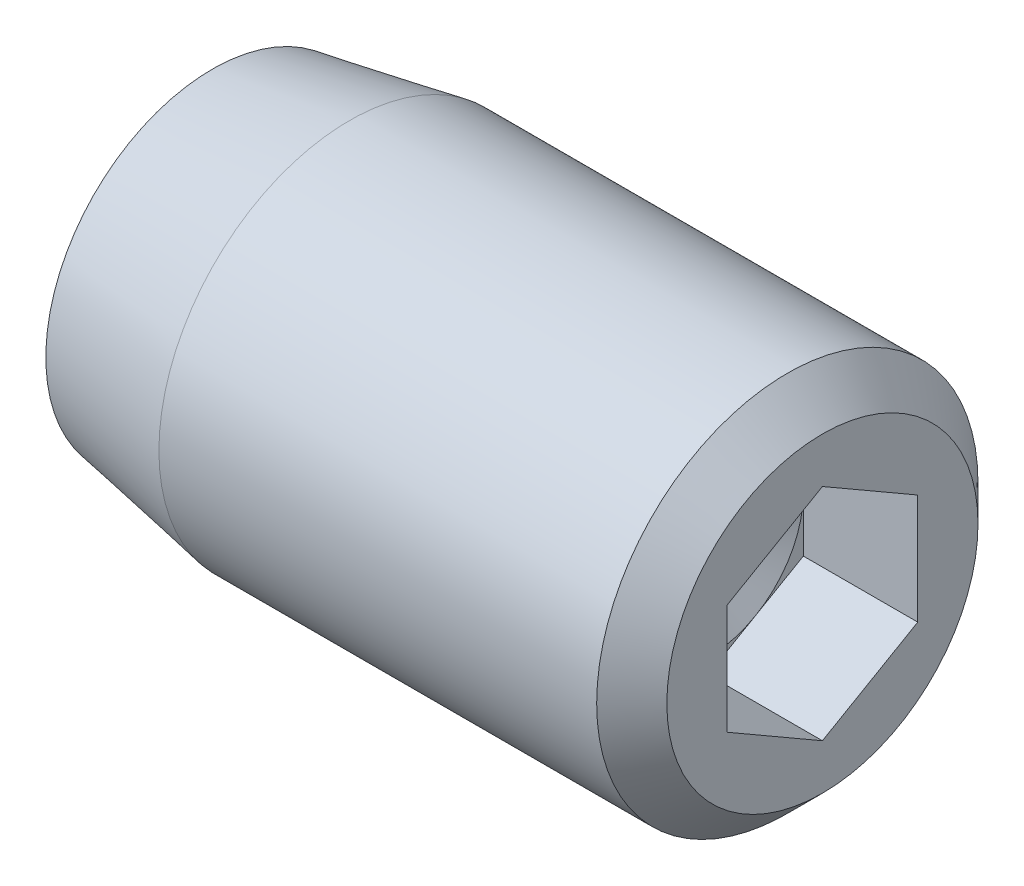
ISO-10303-21;
HEADER;
FILE_DESCRIPTION(('STEP AP214'),'2;1');
FILE_NAME('part.step','',(''),(''),'','','');
FILE_SCHEMA(('AUTOMOTIVE_DESIGN { 1 0 10303 214 1 1 1 1 }'));
ENDSEC;
DATA;
#1=APPLICATION_CONTEXT('core data for automotive mechanical design processes');
#2=APPLICATION_PROTOCOL_DEFINITION('international standard','automotive_design',2000,#1);
#3=PRODUCT_CONTEXT('',#1,'mechanical');
#4=PRODUCT('Part','Part','',(#3));
#5=PRODUCT_RELATED_PRODUCT_CATEGORY('part','',(#4));
#6=PRODUCT_DEFINITION_FORMATION('','',#4);
#7=PRODUCT_DEFINITION_CONTEXT('part definition',#1,'design');
#8=PRODUCT_DEFINITION('design','',#6,#7);
#9=PRODUCT_DEFINITION_SHAPE('','',#8);
#10=(LENGTH_UNIT() NAMED_UNIT(*) SI_UNIT(.MILLI.,.METRE.));
#11=(NAMED_UNIT(*) PLANE_ANGLE_UNIT() SI_UNIT($,.RADIAN.));
#12=(NAMED_UNIT(*) SI_UNIT($,.STERADIAN.) SOLID_ANGLE_UNIT());
#13=UNCERTAINTY_MEASURE_WITH_UNIT(LENGTH_MEASURE(1.E-05),#10,'distance_accuracy_value','');
#14=(GEOMETRIC_REPRESENTATION_CONTEXT(3) GLOBAL_UNCERTAINTY_ASSIGNED_CONTEXT((#13)) GLOBAL_UNIT_ASSIGNED_CONTEXT((#10,
#11,#12)) REPRESENTATION_CONTEXT('',''));
#15=CARTESIAN_POINT('',(0.,0.,0.));
#16=DIRECTION('',(0.,0.,1.));
#17=DIRECTION('',(1.,0.,0.));
#18=AXIS2_PLACEMENT_3D('',#15,#16,#17);
#19=CARTESIAN_POINT('',(13.,-2.8867513459481,1.24999999999996));
#20=DIRECTION('',(1.,0.,0.));
#21=DIRECTION('',(0.,0.,-1.));
#22=AXIS2_PLACEMENT_3D('',#19,#20,#21);
#23=PLANE('',#22);
#24=DIRECTION('',(0.,0.499999999999984,-0.866025403784448));
#25=VECTOR('',#24,1.);
#26=CARTESIAN_POINT('',(13.,-2.8867513459481,0.));
#27=LINE('',#26,#25);
#28=CARTESIAN_POINT('',(13.,-2.8867513459481,0.));
#29=VERTEX_POINT('',#28);
#30=CARTESIAN_POINT('',(13.,-2.16506350946112,-1.24999999999996));
#31=VERTEX_POINT('',#30);
#32=EDGE_CURVE('P0_E94',#29,#31,#27,.T.);
#33=ORIENTED_EDGE('',*,*,#32,.T.);
#34=CARTESIAN_POINT('',(13.,0.,0.));
#35=DIRECTION('',(-1.,0.,0.));
#36=DIRECTION('',(0.,-0.866025403784448,-0.499999999999983));
#37=AXIS2_PLACEMENT_3D('',#34,#35,#36);
#38=CIRCLE('',#37,2.49999999999999);
#39=CARTESIAN_POINT('',(13.,-2.16506350946111,1.24999999999996));
#40=VERTEX_POINT('',#39);
#41=EDGE_CURVE('P0_E108',#31,#40,#38,.T.);
#42=ORIENTED_EDGE('',*,*,#41,.T.);
#43=DIRECTION('',(0.,-0.499999999999985,-0.866025403784447));
#44=VECTOR('',#43,1.);
#45=CARTESIAN_POINT('',(13.,-2.16506350946112,1.24999999999996));
#46=LINE('',#45,#44);
#47=EDGE_CURVE('P0_E110',#40,#29,#46,.T.);
#48=ORIENTED_EDGE('',*,*,#47,.T.);
#49=EDGE_LOOP('',(#33,#42,#48));
#50=FACE_BOUND('',#49,.T.);
#51=ADVANCED_FACE('P0_F16',(#50),#23,.T.);
#52=CARTESIAN_POINT('',(13.,-2.16506350946112,2.5));
#53=DIRECTION('',(1.,0.,0.));
#54=DIRECTION('',(0.,0.,-1.));
#55=AXIS2_PLACEMENT_3D('',#52,#53,#54);
#56=PLANE('',#55);
#57=DIRECTION('',(0.,-0.499999999999982,-0.866025403784449));
#58=VECTOR('',#57,1.);
#59=CARTESIAN_POINT('',(13.,-1.4433756729741,2.5));
#60=LINE('',#59,#58);
#61=CARTESIAN_POINT('',(13.,-1.4433756729741,2.5));
#62=VERTEX_POINT('',#61);
#63=EDGE_CURVE('P0_E335',#62,#40,#60,.T.);
#64=ORIENTED_EDGE('',*,*,#63,.T.);
#65=CARTESIAN_POINT('',(13.,0.,0.));
#66=DIRECTION('',(-1.,0.,0.));
#67=DIRECTION('',(0.,-0.866025403784448,0.499999999999984));
#68=AXIS2_PLACEMENT_3D('',#65,#66,#67);
#69=CIRCLE('',#68,2.49999999999999);
#70=CARTESIAN_POINT('',(13.,0.,2.49999999999999));
#71=VERTEX_POINT('',#70);
#72=EDGE_CURVE('P0_E115',#40,#71,#69,.T.);
#73=ORIENTED_EDGE('',*,*,#72,.T.);
#74=DIRECTION('',(0.,-1.,0.));
#75=VECTOR('',#74,1.);
#76=CARTESIAN_POINT('',(13.,0.,2.5));
#77=LINE('',#76,#75);
#78=EDGE_CURVE('P0_E325',#71,#62,#77,.T.);
#79=ORIENTED_EDGE('',*,*,#78,.T.);
#80=EDGE_LOOP('',(#64,#73,#79));
#81=FACE_BOUND('',#80,.T.);
#82=ADVANCED_FACE('P0_F263',(#81),#56,.T.);
#83=CARTESIAN_POINT('',(13.,0.,2.5));
#84=DIRECTION('',(1.,0.,0.));
#85=DIRECTION('',(0.,0.,-1.));
#86=AXIS2_PLACEMENT_3D('',#83,#84,#85);
#87=PLANE('',#86);
#88=DIRECTION('',(0.,-1.,0.));
#89=VECTOR('',#88,1.);
#90=CARTESIAN_POINT('',(13.,1.4433756729741,2.5));
#91=LINE('',#90,#89);
#92=CARTESIAN_POINT('',(13.,1.4433756729741,2.5));
#93=VERTEX_POINT('',#92);
#94=EDGE_CURVE('P0_E319',#93,#71,#91,.T.);
#95=ORIENTED_EDGE('',*,*,#94,.T.);
#96=CARTESIAN_POINT('',(13.,0.,0.));
#97=DIRECTION('',(-1.,0.,0.));
#98=DIRECTION('',(0.,0.,1.));
#99=AXIS2_PLACEMENT_3D('',#96,#97,#98);
#100=CIRCLE('',#99,2.49999999999999);
#101=CARTESIAN_POINT('',(13.,2.16506350946112,1.24999999999996));
#102=VERTEX_POINT('',#101);
#103=EDGE_CURVE('P0_E296',#71,#102,#100,.T.);
#104=ORIENTED_EDGE('',*,*,#103,.T.);
#105=DIRECTION('',(0.,-0.499999999999982,0.866025403784449));
#106=VECTOR('',#105,1.);
#107=CARTESIAN_POINT('',(13.,2.16506350946112,1.24999999999996));
#108=LINE('',#107,#106);
#109=EDGE_CURVE('P0_E289',#102,#93,#108,.T.);
#110=ORIENTED_EDGE('',*,*,#109,.T.);
#111=EDGE_LOOP('',(#95,#104,#110));
#112=FACE_BOUND('',#111,.T.);
#113=ADVANCED_FACE('P0_F268',(#112),#87,.T.);
#114=CARTESIAN_POINT('',(13.,2.16506350946112,1.24999999999996));
#115=DIRECTION('',(1.,0.,0.));
#116=DIRECTION('',(0.,0.,-1.));
#117=AXIS2_PLACEMENT_3D('',#114,#115,#116);
#118=PLANE('',#117);
#119=DIRECTION('',(0.,-0.499999999999983,0.866025403784448));
#120=VECTOR('',#119,1.);
#121=CARTESIAN_POINT('',(13.,2.8867513459481,0.));
#122=LINE('',#121,#120);
#123=CARTESIAN_POINT('',(13.,2.8867513459481,0.));
#124=VERTEX_POINT('',#123);
#125=EDGE_CURVE('P0_E282',#124,#102,#122,.T.);
#126=ORIENTED_EDGE('',*,*,#125,.T.);
#127=CARTESIAN_POINT('',(13.,0.,0.));
#128=DIRECTION('',(-1.,0.,0.));
#129=DIRECTION('',(0.,0.866025403784448,0.499999999999983));
#130=AXIS2_PLACEMENT_3D('',#127,#128,#129);
#131=CIRCLE('',#130,2.49999999999999);
#132=CARTESIAN_POINT('',(13.,2.16506350946112,-1.24999999999995));
#133=VERTEX_POINT('',#132);
#134=EDGE_CURVE('P0_E283',#102,#133,#131,.T.);
#135=ORIENTED_EDGE('',*,*,#134,.T.);
#136=DIRECTION('',(0.,0.499999999999984,0.866025403784448));
#137=VECTOR('',#136,1.);
#138=CARTESIAN_POINT('',(13.,2.16506350946112,-1.24999999999996));
#139=LINE('',#138,#137);
#140=EDGE_CURVE('P0_E125',#133,#124,#139,.T.);
#141=ORIENTED_EDGE('',*,*,#140,.T.);
#142=EDGE_LOOP('',(#126,#135,#141));
#143=FACE_BOUND('',#142,.T.);
#144=ADVANCED_FACE('P0_F260',(#143),#118,.T.);
#145=CARTESIAN_POINT('',(13.,-2.16506350946112,-1.24999999999996));
#146=DIRECTION('',(1.,0.,0.));
#147=DIRECTION('',(0.,0.,-1.));
#148=AXIS2_PLACEMENT_3D('',#145,#146,#147);
#149=PLANE('',#148);
#150=DIRECTION('',(0.,1.,0.));
#151=VECTOR('',#150,1.);
#152=CARTESIAN_POINT('',(13.,-1.4433756729741,-2.5));
#153=LINE('',#152,#151);
#154=CARTESIAN_POINT('',(13.,-1.4433756729741,-2.5));
#155=VERTEX_POINT('',#154);
#156=CARTESIAN_POINT('',(13.,0.,-2.5));
#157=VERTEX_POINT('',#156);
#158=EDGE_CURVE('P0_E119',#155,#157,#153,.T.);
#159=ORIENTED_EDGE('',*,*,#158,.T.);
#160=CARTESIAN_POINT('',(13.,0.,0.));
#161=DIRECTION('',(-1.,0.,0.));
#162=DIRECTION('',(0.,0.,-1.));
#163=AXIS2_PLACEMENT_3D('',#160,#161,#162);
#164=CIRCLE('',#163,2.49999999999999);
#165=EDGE_CURVE('P0_E102',#157,#31,#164,.T.);
#166=ORIENTED_EDGE('',*,*,#165,.T.);
#167=DIRECTION('',(0.,0.499999999999982,-0.866025403784449));
#168=VECTOR('',#167,1.);
#169=CARTESIAN_POINT('',(13.,-2.16506350946112,-1.24999999999996));
#170=LINE('',#169,#168);
#171=EDGE_CURVE('P0_E90',#31,#155,#170,.T.);
#172=ORIENTED_EDGE('',*,*,#171,.T.);
#173=EDGE_LOOP('',(#159,#166,#172));
#174=FACE_BOUND('',#173,.T.);
#175=ADVANCED_FACE('P0_F118',(#174),#149,.T.);
#176=CARTESIAN_POINT('',(10.,-3.,3.));
#177=DIRECTION('',(-1.,0.,0.));
#178=DIRECTION('',(0.,1.,0.));
#179=AXIS2_PLACEMENT_3D('',#176,#177,#178);
#180=PLANE('',#179);
#181=CARTESIAN_POINT('',(10.,0.,0.));
#182=DIRECTION('',(-1.,0.,0.));
#183=DIRECTION('',(0.,0.,-1.));
#184=AXIS2_PLACEMENT_3D('',#181,#182,#183);
#185=CIRCLE('',#184,3.);
#186=CARTESIAN_POINT('',(10.,0.,-3.));
#187=VERTEX_POINT('',#186);
#188=EDGE_CURVE('P0_E101',#187,#187,#185,.F.);
#189=ORIENTED_EDGE('',*,*,#188,.F.);
#190=EDGE_LOOP('',(#189));
#191=FACE_BOUND('',#190,.T.);
#192=ADVANCED_FACE('P0_F244',(#191),#180,.T.);
#193=CARTESIAN_POINT('',(0.,-4.36522286944953,4.36522320467784));
#194=DIRECTION('',(-1.,0.,0.));
#195=DIRECTION('',(0.,1.,0.));
#196=AXIS2_PLACEMENT_3D('',#193,#194,#195);
#197=PLANE('',#196);
#198=CARTESIAN_POINT('',(0.,0.,0.));
#199=DIRECTION('',(-1.,0.,0.));
#200=DIRECTION('',(0.,0.,-1.));
#201=AXIS2_PLACEMENT_3D('',#198,#199,#200);
#202=CIRCLE('',#201,4.3652228694495);
#203=CARTESIAN_POINT('',(0.,0.,-4.3652228694495));
#204=VERTEX_POINT('',#203);
#205=EDGE_CURVE('P0_E137',#204,#204,#202,.F.);
#206=ORIENTED_EDGE('',*,*,#205,.F.);
#207=EDGE_LOOP('',(#206));
#208=FACE_BOUND('',#207,.T.);
#209=CARTESIAN_POINT('',(0.,0.,0.));
#210=DIRECTION('',(1.,0.,0.));
#211=DIRECTION('',(0.,0.,1.));
#212=AXIS2_PLACEMENT_3D('',#209,#210,#211);
#213=CIRCLE('',#212,3.);
#214=CARTESIAN_POINT('',(0.,0.,3.));
#215=VERTEX_POINT('',#214);
#216=EDGE_CURVE('P0_E141',#215,#215,#213,.T.);
#217=ORIENTED_EDGE('',*,*,#216,.T.);
#218=EDGE_LOOP('',(#217));
#219=FACE_BOUND('',#218,.T.);
#220=ADVANCED_FACE('P0_F240',(#208,#219),#197,.T.);
#221=CARTESIAN_POINT('',(16.,-4.07999980192479,-4.08000000000001));
#222=DIRECTION('',(1.,0.,0.));
#223=DIRECTION('',(0.,1.,0.));
#224=AXIS2_PLACEMENT_3D('',#221,#222,#223);
#225=PLANE('',#224);
#226=CARTESIAN_POINT('',(16.,0.,0.));
#227=DIRECTION('',(1.,0.,0.));
#228=DIRECTION('',(0.,-1.42331231550175E-07,0.99999999999999));
#229=AXIS2_PLACEMENT_3D('',#226,#227,#228);
#230=CIRCLE('',#229,4.08);
#231=CARTESIAN_POINT('',(16.,-5.80711424724716E-07,4.07999999999996));
#232=VERTEX_POINT('',#231);
#233=EDGE_CURVE('P0_E145',#232,#232,#230,.T.);
#234=ORIENTED_EDGE('',*,*,#233,.T.);
#235=EDGE_LOOP('',(#234));
#236=FACE_BOUND('',#235,.T.);
#237=DIRECTION('',(0.,0.499999999999984,-0.866025403784448));
#238=VECTOR('',#237,1.);
#239=CARTESIAN_POINT('',(16.,1.4433756729741,2.5));
#240=LINE('',#239,#238);
#241=CARTESIAN_POINT('',(16.,2.8867513459481,0.));
#242=VERTEX_POINT('',#241);
#243=CARTESIAN_POINT('',(16.,1.4433756729741,2.5));
#244=VERTEX_POINT('',#243);
#245=EDGE_CURVE('P0_E149',#242,#244,#240,.F.);
#246=ORIENTED_EDGE('',*,*,#245,.F.);
#247=DIRECTION('',(0.,-0.499999999999984,-0.866025403784448));
#248=VECTOR('',#247,1.);
#249=CARTESIAN_POINT('',(16.,2.8867513459481,0.));
#250=LINE('',#249,#248);
#251=CARTESIAN_POINT('',(16.,1.4433756729741,-2.5));
#252=VERTEX_POINT('',#251);
#253=EDGE_CURVE('P0_E152',#252,#242,#250,.F.);
#254=ORIENTED_EDGE('',*,*,#253,.F.);
#255=DIRECTION('',(0.,-1.,0.));
#256=VECTOR('',#255,1.);
#257=CARTESIAN_POINT('',(16.,1.4433756729741,-2.5));
#258=LINE('',#257,#256);
#259=CARTESIAN_POINT('',(16.,-1.4433756729741,-2.5));
#260=VERTEX_POINT('',#259);
#261=EDGE_CURVE('P0_E158',#260,#252,#258,.F.);
#262=ORIENTED_EDGE('',*,*,#261,.F.);
#263=DIRECTION('',(0.,-0.499999999999983,0.866025403784448));
#264=VECTOR('',#263,1.);
#265=CARTESIAN_POINT('',(16.,-1.4433756729741,-2.5));
#266=LINE('',#265,#264);
#267=CARTESIAN_POINT('',(16.,-2.8867513459481,0.));
#268=VERTEX_POINT('',#267);
#269=EDGE_CURVE('P0_E164',#268,#260,#266,.F.);
#270=ORIENTED_EDGE('',*,*,#269,.F.);
#271=DIRECTION('',(0.,0.499999999999983,0.866025403784448));
#272=VECTOR('',#271,1.);
#273=CARTESIAN_POINT('',(16.,-2.8867513459481,0.));
#274=LINE('',#273,#272);
#275=CARTESIAN_POINT('',(16.,-1.4433756729741,2.5));
#276=VERTEX_POINT('',#275);
#277=EDGE_CURVE('P0_E169',#276,#268,#274,.F.);
#278=ORIENTED_EDGE('',*,*,#277,.F.);
#279=DIRECTION('',(0.,1.,0.));
#280=VECTOR('',#279,1.);
#281=CARTESIAN_POINT('',(16.,-1.4433756729741,2.5));
#282=LINE('',#281,#280);
#283=EDGE_CURVE('P0_E175',#244,#276,#282,.F.);
#284=ORIENTED_EDGE('',*,*,#283,.F.);
#285=EDGE_LOOP('',(#246,#254,#262,#270,#278,#284));
#286=FACE_BOUND('',#285,.T.);
#287=ADVANCED_FACE('P0_F243',(#236,#286),#225,.T.);
#288=CARTESIAN_POINT('',(13.,-1.4433756729741,2.5));
#289=DIRECTION('',(0.,0.,-1.));
#290=DIRECTION('',(0.,1.,0.));
#291=AXIS2_PLACEMENT_3D('',#288,#289,#290);
#292=PLANE('',#291);
#293=ORIENTED_EDGE('',*,*,#283,.T.);
#294=DIRECTION('',(-1.,0.,0.));
#295=VECTOR('',#294,1.);
#296=CARTESIAN_POINT('',(16.,-1.4433756729741,2.5));
#297=LINE('',#296,#295);
#298=EDGE_CURVE('P0_E181',#62,#276,#297,.F.);
#299=ORIENTED_EDGE('',*,*,#298,.F.);
#300=ORIENTED_EDGE('',*,*,#78,.F.);
#301=ORIENTED_EDGE('',*,*,#94,.F.);
#302=DIRECTION('',(1.,0.,0.));
#303=VECTOR('',#302,1.);
#304=CARTESIAN_POINT('',(13.,1.4433756729741,2.5));
#305=LINE('',#304,#303);
#306=EDGE_CURVE('P0_E186',#93,#244,#305,.T.);
#307=ORIENTED_EDGE('',*,*,#306,.T.);
#308=EDGE_LOOP('',(#293,#299,#300,#301,#307));
#309=FACE_BOUND('',#308,.T.);
#310=ADVANCED_FACE('P0_F363',(#309),#292,.T.);
#311=CARTESIAN_POINT('',(13.,-1.4433756729741,2.5));
#312=DIRECTION('',(0.,0.866025403784449,-0.499999999999983));
#313=DIRECTION('',(1.,0.,0.));
#314=AXIS2_PLACEMENT_3D('',#311,#312,#313);
#315=PLANE('',#314);
#316=ORIENTED_EDGE('',*,*,#277,.T.);
#317=DIRECTION('',(-1.,0.,0.));
#318=VECTOR('',#317,1.);
#319=CARTESIAN_POINT('',(16.,-2.8867513459481,0.));
#320=LINE('',#319,#318);
#321=EDGE_CURVE('P0_E192',#29,#268,#320,.F.);
#322=ORIENTED_EDGE('',*,*,#321,.F.);
#323=ORIENTED_EDGE('',*,*,#47,.F.);
#324=ORIENTED_EDGE('',*,*,#63,.F.);
#325=ORIENTED_EDGE('',*,*,#298,.T.);
#326=EDGE_LOOP('',(#316,#322,#323,#324,#325));
#327=FACE_BOUND('',#326,.T.);
#328=ADVANCED_FACE('P0_F360',(#327),#315,.T.);
#329=CARTESIAN_POINT('',(13.,-2.8867513459481,0.));
#330=DIRECTION('',(0.,0.866025403784449,0.499999999999983));
#331=DIRECTION('',(1.,0.,0.));
#332=AXIS2_PLACEMENT_3D('',#329,#330,#331);
#333=PLANE('',#332);
#334=ORIENTED_EDGE('',*,*,#269,.T.);
#335=DIRECTION('',(-1.,0.,0.));
#336=VECTOR('',#335,1.);
#337=CARTESIAN_POINT('',(16.,-1.4433756729741,-2.5));
#338=LINE('',#337,#336);
#339=EDGE_CURVE('P0_E96',#155,#260,#338,.F.);
#340=ORIENTED_EDGE('',*,*,#339,.F.);
#341=ORIENTED_EDGE('',*,*,#171,.F.);
#342=ORIENTED_EDGE('',*,*,#32,.F.);
#343=ORIENTED_EDGE('',*,*,#321,.T.);
#344=EDGE_LOOP('',(#334,#340,#341,#342,#343));
#345=FACE_BOUND('',#344,.T.);
#346=ADVANCED_FACE('P0_F93',(#345),#333,.T.);
#347=CARTESIAN_POINT('',(16.,-1.4433756729741,-2.5));
#348=DIRECTION('',(0.,0.,1.));
#349=DIRECTION('',(0.,1.,0.));
#350=AXIS2_PLACEMENT_3D('',#347,#348,#349);
#351=PLANE('',#350);
#352=ORIENTED_EDGE('',*,*,#261,.T.);
#353=DIRECTION('',(-1.,0.,0.));
#354=VECTOR('',#353,1.);
#355=CARTESIAN_POINT('',(16.,1.4433756729741,-2.5));
#356=LINE('',#355,#354);
#357=CARTESIAN_POINT('',(13.,1.4433756729741,-2.5));
#358=VERTEX_POINT('',#357);
#359=EDGE_CURVE('P0_E201',#358,#252,#356,.F.);
#360=ORIENTED_EDGE('',*,*,#359,.F.);
#361=DIRECTION('',(0.,-1.,0.));
#362=VECTOR('',#361,1.);
#363=CARTESIAN_POINT('',(13.,1.4433756729741,-2.5));
#364=LINE('',#363,#362);
#365=EDGE_CURVE('P0_E35',#157,#358,#364,.F.);
#366=ORIENTED_EDGE('',*,*,#365,.F.);
#367=ORIENTED_EDGE('',*,*,#158,.F.);
#368=ORIENTED_EDGE('',*,*,#339,.T.);
#369=EDGE_LOOP('',(#352,#360,#366,#367,#368));
#370=FACE_BOUND('',#369,.T.);
#371=ADVANCED_FACE('P0_F373',(#370),#351,.T.);
#372=CARTESIAN_POINT('',(13.,1.4433756729741,-2.5));
#373=DIRECTION('',(0.,-0.866025403784449,0.499999999999983));
#374=DIRECTION('',(1.,0.,0.));
#375=AXIS2_PLACEMENT_3D('',#372,#373,#374);
#376=PLANE('',#375);
#377=ORIENTED_EDGE('',*,*,#253,.T.);
#378=DIRECTION('',(-1.,0.,0.));
#379=VECTOR('',#378,1.);
#380=CARTESIAN_POINT('',(16.,2.8867513459481,0.));
#381=LINE('',#380,#379);
#382=EDGE_CURVE('P0_E210',#124,#242,#381,.F.);
#383=ORIENTED_EDGE('',*,*,#382,.F.);
#384=ORIENTED_EDGE('',*,*,#140,.F.);
#385=DIRECTION('',(0.,-0.499999999999983,-0.866025403784449));
#386=VECTOR('',#385,1.);
#387=CARTESIAN_POINT('',(13.,2.16506350946112,-1.24999999999996));
#388=LINE('',#387,#386);
#389=EDGE_CURVE('P0_E215',#358,#133,#388,.F.);
#390=ORIENTED_EDGE('',*,*,#389,.F.);
#391=ORIENTED_EDGE('',*,*,#359,.T.);
#392=EDGE_LOOP('',(#377,#383,#384,#390,#391));
#393=FACE_BOUND('',#392,.T.);
#394=ADVANCED_FACE('P0_F375',(#393),#376,.T.);
#395=CARTESIAN_POINT('',(13.,2.8867513459481,0.));
#396=DIRECTION('',(0.,-0.866025403784449,-0.499999999999983));
#397=DIRECTION('',(1.,0.,0.));
#398=AXIS2_PLACEMENT_3D('',#395,#396,#397);
#399=PLANE('',#398);
#400=ORIENTED_EDGE('',*,*,#245,.T.);
#401=ORIENTED_EDGE('',*,*,#306,.F.);
#402=ORIENTED_EDGE('',*,*,#109,.F.);
#403=ORIENTED_EDGE('',*,*,#125,.F.);
#404=ORIENTED_EDGE('',*,*,#382,.T.);
#405=EDGE_LOOP('',(#400,#401,#402,#403,#404));
#406=FACE_BOUND('',#405,.T.);
#407=ADVANCED_FACE('P0_F376',(#406),#399,.T.);
#408=CARTESIAN_POINT('',(13.,0.,-1.24999999999996));
#409=DIRECTION('',(1.,0.,0.));
#410=DIRECTION('',(0.,0.,-1.));
#411=AXIS2_PLACEMENT_3D('',#408,#409,#410);
#412=PLANE('',#411);
#413=ORIENTED_EDGE('',*,*,#389,.T.);
#414=CARTESIAN_POINT('',(13.,0.,0.));
#415=DIRECTION('',(-1.,0.,0.));
#416=DIRECTION('',(0.,0.866025403784448,-0.499999999999983));
#417=AXIS2_PLACEMENT_3D('',#414,#415,#416);
#418=CIRCLE('',#417,2.49999999999999);
#419=EDGE_CURVE('P0_E220',#133,#157,#418,.T.);
#420=ORIENTED_EDGE('',*,*,#419,.T.);
#421=ORIENTED_EDGE('',*,*,#365,.T.);
#422=EDGE_LOOP('',(#413,#420,#421));
#423=FACE_BOUND('',#422,.T.);
#424=ADVANCED_FACE('P0_F250',(#423),#412,.T.);
#425=CARTESIAN_POINT('',(16.,0.,0.));
#426=DIRECTION('',(1.,0.,0.));
#427=DIRECTION('',(0.,0.,1.));
#428=AXIS2_PLACEMENT_3D('',#425,#426,#427);
#429=CYLINDRICAL_SURFACE('',#428,3.);
#430=ORIENTED_EDGE('',*,*,#216,.F.);
#431=EDGE_LOOP('',(#430));
#432=FACE_BOUND('',#431,.T.);
#433=ORIENTED_EDGE('',*,*,#188,.T.);
#434=EDGE_LOOP('',(#433));
#435=FACE_BOUND('',#434,.T.);
#436=ADVANCED_FACE('P0_F236',(#432,#435),#429,.F.);
#437=CARTESIAN_POINT('',(3.6,0.,0.));
#438=DIRECTION('',(1.,0.,0.));
#439=DIRECTION('',(0.,1.42097602695907E-07,0.99999999999999));
#440=AXIS2_PLACEMENT_3D('',#437,#438,#439);
#441=CONICAL_SURFACE('',#440,5.,0.174532925199439);
#442=CARTESIAN_POINT('',(3.6,0.,0.));
#443=DIRECTION('',(-1.,0.,0.));
#444=DIRECTION('',(0.,0.,-1.));
#445=AXIS2_PLACEMENT_3D('',#442,#443,#444);
#446=CIRCLE('',#445,5.);
#447=CARTESIAN_POINT('',(3.6,0.,-5.));
#448=VERTEX_POINT('',#447);
#449=EDGE_CURVE('P0_E25',#448,#448,#446,.F.);
#450=ORIENTED_EDGE('',*,*,#449,.F.);
#451=EDGE_LOOP('',(#450));
#452=FACE_BOUND('',#451,.T.);
#453=ORIENTED_EDGE('',*,*,#205,.T.);
#454=EDGE_LOOP('',(#453));
#455=FACE_BOUND('',#454,.T.);
#456=ADVANCED_FACE('P0_F233',(#452,#455),#441,.T.);
#457=CARTESIAN_POINT('',(16.,0.,0.));
#458=DIRECTION('',(1.,0.,0.));
#459=DIRECTION('',(0.,7.6930696291819E-10,1.));
#460=AXIS2_PLACEMENT_3D('',#457,#458,#459);
#461=CYLINDRICAL_SURFACE('',#460,5.);
#462=CARTESIAN_POINT('',(15.08,0.,0.));
#463=DIRECTION('',(-1.,0.,0.));
#464=DIRECTION('',(0.,0.,-1.));
#465=AXIS2_PLACEMENT_3D('',#462,#463,#464);
#466=CIRCLE('',#465,5.);
#467=CARTESIAN_POINT('',(15.08,0.,-5.));
#468=VERTEX_POINT('',#467);
#469=EDGE_CURVE('P0_E11',#468,#468,#466,.F.);
#470=ORIENTED_EDGE('',*,*,#469,.F.);
#471=EDGE_LOOP('',(#470));
#472=FACE_BOUND('',#471,.T.);
#473=ORIENTED_EDGE('',*,*,#449,.T.);
#474=EDGE_LOOP('',(#473));
#475=FACE_BOUND('',#474,.T.);
#476=ADVANCED_FACE('P0_F231',(#472,#475),#461,.T.);
#477=CARTESIAN_POINT('',(15.08,0.,0.));
#478=DIRECTION('',(-1.,0.,0.));
#479=DIRECTION('',(0.,0.,-1.));
#480=AXIS2_PLACEMENT_3D('',#477,#478,#479);
#481=CONICAL_SURFACE('',#480,5.,0.785398163397447);
#482=ORIENTED_EDGE('',*,*,#233,.F.);
#483=EDGE_LOOP('',(#482));
#484=FACE_BOUND('',#483,.T.);
#485=ORIENTED_EDGE('',*,*,#469,.T.);
#486=EDGE_LOOP('',(#485));
#487=FACE_BOUND('',#486,.T.);
#488=ADVANCED_FACE('P0_F388',(#484,#487),#481,.T.);
#489=CARTESIAN_POINT('',(13.,0.,0.));
#490=DIRECTION('',(1.,0.,0.));
#491=DIRECTION('',(0.,0.,1.));
#492=AXIS2_PLACEMENT_3D('',#489,#490,#491);
#493=CONICAL_SURFACE('',#492,2.5,1.04719755119662);
#494=ORIENTED_EDGE('',*,*,#72,.F.);
#495=ORIENTED_EDGE('',*,*,#41,.F.);
#496=ORIENTED_EDGE('',*,*,#165,.F.);
#497=ORIENTED_EDGE('',*,*,#419,.F.);
#498=ORIENTED_EDGE('',*,*,#134,.F.);
#499=ORIENTED_EDGE('',*,*,#103,.F.);
#500=EDGE_LOOP('',(#494,#495,#496,#497,#498,#499));
#501=FACE_BOUND('',#500,.T.);
#502=CARTESIAN_POINT('',(11.556624327026,0.,0.));
#503=VERTEX_POINT('',#502);
#504=VERTEX_LOOP('',#503);
#505=FACE_BOUND('',#504,.T.);
#506=ADVANCED_FACE('P0_F18',(#501,#505),#493,.F.);
#507=CLOSED_SHELL('',(#51,#82,#113,#144,#175,#192,#220,#287,#310,#328,#346,#371,#394,#407,#424,
#436,#456,#476,#488,#506));
#508=MANIFOLD_SOLID_BREP('P0_B1',#507);
#509=CARTESIAN_POINT('',(1.,0.,0.));
#510=DIRECTION('',(0.,-1.,0.));
#511=DIRECTION('',(1.,0.,0.));
#512=AXIS2_PLACEMENT_3D('',#509,#510,#511);
#513=SPHERICAL_SURFACE('',#512,3.);
#514=CARTESIAN_POINT('',(1.,-3.,0.));
#515=VERTEX_POINT('',#514);
#516=VERTEX_LOOP('',#515);
#517=FACE_BOUND('',#516,.T.);
#518=ADVANCED_FACE('P1_F12',(#517),#513,.T.);
#519=CLOSED_SHELL('',(#518));
#520=MANIFOLD_SOLID_BREP('P1_B1',#519);
#521=ADVANCED_BREP_SHAPE_REPRESENTATION('',(#18,#508,#520),#14);
#522=SHAPE_DEFINITION_REPRESENTATION(#9,#521);
ENDSEC;
END-ISO-10303-21;
